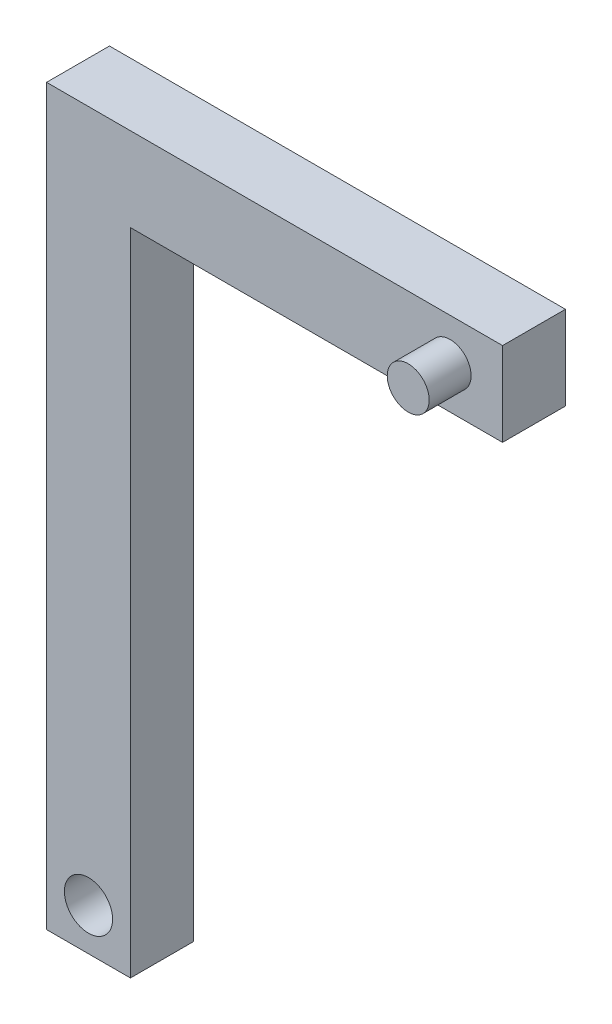
ISO-10303-21;
HEADER;
FILE_DESCRIPTION(('STEP AP214'),'2;1');
FILE_NAME('part.step','',(''),(''),'','','');
FILE_SCHEMA(('AUTOMOTIVE_DESIGN { 1 0 10303 214 1 1 1 1 }'));
ENDSEC;
DATA;
#1=APPLICATION_CONTEXT('core data for automotive mechanical design processes');
#2=APPLICATION_PROTOCOL_DEFINITION('international standard','automotive_design',2000,#1);
#3=PRODUCT_CONTEXT('',#1,'mechanical');
#4=PRODUCT('Part','Part','',(#3));
#5=PRODUCT_RELATED_PRODUCT_CATEGORY('part','',(#4));
#6=PRODUCT_DEFINITION_FORMATION('','',#4);
#7=PRODUCT_DEFINITION_CONTEXT('part definition',#1,'design');
#8=PRODUCT_DEFINITION('design','',#6,#7);
#9=PRODUCT_DEFINITION_SHAPE('','',#8);
#10=(LENGTH_UNIT() NAMED_UNIT(*) SI_UNIT(.MILLI.,.METRE.));
#11=(NAMED_UNIT(*) PLANE_ANGLE_UNIT() SI_UNIT($,.RADIAN.));
#12=(NAMED_UNIT(*) SI_UNIT($,.STERADIAN.) SOLID_ANGLE_UNIT());
#13=UNCERTAINTY_MEASURE_WITH_UNIT(LENGTH_MEASURE(1.E-05),#10,'distance_accuracy_value','');
#14=(GEOMETRIC_REPRESENTATION_CONTEXT(3) GLOBAL_UNCERTAINTY_ASSIGNED_CONTEXT((#13)) GLOBAL_UNIT_ASSIGNED_CONTEXT((#10,
#11,#12)) REPRESENTATION_CONTEXT('',''));
#15=CARTESIAN_POINT('',(0.,0.,0.));
#16=DIRECTION('',(0.,0.,1.));
#17=DIRECTION('',(1.,0.,0.));
#18=AXIS2_PLACEMENT_3D('',#15,#16,#17);
#19=CARTESIAN_POINT('',(0.,-4.,3.));
#20=DIRECTION('',(0.,1.,0.));
#21=DIRECTION('',(0.,0.,1.));
#22=AXIS2_PLACEMENT_3D('',#19,#20,#21);
#23=PLANE('',#22);
#24=DIRECTION('',(1.,0.,0.));
#25=VECTOR('',#24,1.);
#26=CARTESIAN_POINT('',(0.,-4.,3.));
#27=LINE('',#26,#25);
#28=CARTESIAN_POINT('',(4.75,-4.,3.));
#29=VERTEX_POINT('',#28);
#30=CARTESIAN_POINT('',(22.5,-4.,3.));
#31=VERTEX_POINT('',#30);
#32=EDGE_CURVE('E85',#29,#31,#27,.T.);
#33=ORIENTED_EDGE('',*,*,#32,.F.);
#34=DIRECTION('',(0.,0.,-1.));
#35=VECTOR('',#34,1.);
#36=CARTESIAN_POINT('',(4.75,-4.,3.));
#37=LINE('',#36,#35);
#38=CARTESIAN_POINT('',(4.75,-4.,0.));
#39=VERTEX_POINT('',#38);
#40=EDGE_CURVE('E97',#29,#39,#37,.T.);
#41=ORIENTED_EDGE('',*,*,#40,.T.);
#42=DIRECTION('',(1.,0.,0.));
#43=VECTOR('',#42,1.);
#44=CARTESIAN_POINT('',(0.,-4.,0.));
#45=LINE('',#44,#43);
#46=CARTESIAN_POINT('',(22.5,-4.,0.));
#47=VERTEX_POINT('',#46);
#48=EDGE_CURVE('E95',#39,#47,#45,.T.);
#49=ORIENTED_EDGE('',*,*,#48,.T.);
#50=DIRECTION('',(0.,0.,-1.));
#51=VECTOR('',#50,1.);
#52=CARTESIAN_POINT('',(22.5,-4.,3.));
#53=LINE('',#52,#51);
#54=EDGE_CURVE('E39',#31,#47,#53,.T.);
#55=ORIENTED_EDGE('',*,*,#54,.F.);
#56=EDGE_LOOP('',(#33,#41,#49,#55));
#57=FACE_BOUND('',#56,.T.);
#58=ADVANCED_FACE('F36',(#57),#23,.F.);
#59=CARTESIAN_POINT('',(22.5,0.,3.));
#60=DIRECTION('',(1.,0.,0.));
#61=DIRECTION('',(0.,0.,-1.));
#62=AXIS2_PLACEMENT_3D('',#59,#60,#61);
#63=PLANE('',#62);
#64=DIRECTION('',(0.,-1.,0.));
#65=VECTOR('',#64,1.);
#66=CARTESIAN_POINT('',(22.5,0.,0.));
#67=LINE('',#66,#65);
#68=CARTESIAN_POINT('',(22.5,0.,0.));
#69=VERTEX_POINT('',#68);
#70=EDGE_CURVE('E79',#69,#47,#67,.T.);
#71=ORIENTED_EDGE('',*,*,#70,.F.);
#72=DIRECTION('',(0.,0.,-1.));
#73=VECTOR('',#72,1.);
#74=CARTESIAN_POINT('',(22.5,0.,3.));
#75=LINE('',#74,#73);
#76=CARTESIAN_POINT('',(22.5,0.,3.));
#77=VERTEX_POINT('',#76);
#78=EDGE_CURVE('E87',#77,#69,#75,.T.);
#79=ORIENTED_EDGE('',*,*,#78,.F.);
#80=DIRECTION('',(0.,-1.,0.));
#81=VECTOR('',#80,1.);
#82=CARTESIAN_POINT('',(22.5,0.,3.));
#83=LINE('',#82,#81);
#84=EDGE_CURVE('E101',#77,#31,#83,.T.);
#85=ORIENTED_EDGE('',*,*,#84,.T.);
#86=ORIENTED_EDGE('',*,*,#54,.T.);
#87=EDGE_LOOP('',(#71,#79,#85,#86));
#88=FACE_BOUND('',#87,.T.);
#89=ADVANCED_FACE('F93',(#88),#63,.T.);
#90=CARTESIAN_POINT('',(0.,0.,3.));
#91=DIRECTION('',(0.,1.,0.));
#92=DIRECTION('',(0.,0.,1.));
#93=AXIS2_PLACEMENT_3D('',#90,#91,#92);
#94=PLANE('',#93);
#95=DIRECTION('',(0.,0.,-1.));
#96=VECTOR('',#95,1.);
#97=CARTESIAN_POINT('',(0.749999999999998,0.,3.));
#98=LINE('',#97,#96);
#99=CARTESIAN_POINT('',(0.749999999999998,0.,3.));
#100=VERTEX_POINT('',#99);
#101=CARTESIAN_POINT('',(0.749999999999998,0.,0.));
#102=VERTEX_POINT('',#101);
#103=EDGE_CURVE('E116',#100,#102,#98,.T.);
#104=ORIENTED_EDGE('',*,*,#103,.F.);
#105=DIRECTION('',(1.,0.,0.));
#106=VECTOR('',#105,1.);
#107=CARTESIAN_POINT('',(0.,0.,3.));
#108=LINE('',#107,#106);
#109=EDGE_CURVE('E60',#100,#77,#108,.T.);
#110=ORIENTED_EDGE('',*,*,#109,.T.);
#111=ORIENTED_EDGE('',*,*,#78,.T.);
#112=DIRECTION('',(1.,0.,0.));
#113=VECTOR('',#112,1.);
#114=CARTESIAN_POINT('',(0.,0.,0.));
#115=LINE('',#114,#113);
#116=EDGE_CURVE('E75',#102,#69,#115,.T.);
#117=ORIENTED_EDGE('',*,*,#116,.F.);
#118=EDGE_LOOP('',(#104,#110,#111,#117));
#119=FACE_BOUND('',#118,.T.);
#120=ADVANCED_FACE('F88',(#119),#94,.T.);
#121=CARTESIAN_POINT('',(0.,0.,3.));
#122=DIRECTION('',(0.,0.,1.));
#123=DIRECTION('',(1.,0.,0.));
#124=AXIS2_PLACEMENT_3D('',#121,#122,#123);
#125=PLANE('',#124);
#126=CARTESIAN_POINT('',(2.75,-33.,3.));
#127=DIRECTION('',(0.,0.,1.));
#128=DIRECTION('',(1.,0.,0.));
#129=AXIS2_PLACEMENT_3D('',#126,#127,#128);
#130=CIRCLE('',#129,1.15);
#131=CARTESIAN_POINT('',(3.89999999999999,-33.,3.));
#132=VERTEX_POINT('',#131);
#133=EDGE_CURVE('E128',#132,#132,#130,.T.);
#134=ORIENTED_EDGE('',*,*,#133,.F.);
#135=EDGE_LOOP('',(#134));
#136=FACE_BOUND('',#135,.T.);
#137=CARTESIAN_POINT('',(20.,-2.,3.));
#138=DIRECTION('',(0.,0.,1.));
#139=DIRECTION('',(1.,0.,0.));
#140=AXIS2_PLACEMENT_3D('',#137,#138,#139);
#141=CIRCLE('',#140,1.);
#142=CARTESIAN_POINT('',(21.,-2.,3.));
#143=VERTEX_POINT('',#142);
#144=EDGE_CURVE('E11',#143,#143,#141,.T.);
#145=ORIENTED_EDGE('',*,*,#144,.F.);
#146=EDGE_LOOP('',(#145));
#147=FACE_BOUND('',#146,.T.);
#148=ORIENTED_EDGE('',*,*,#109,.F.);
#149=DIRECTION('',(0.,1.,0.));
#150=VECTOR('',#149,1.);
#151=CARTESIAN_POINT('',(0.749999999999998,-4.,3.));
#152=LINE('',#151,#150);
#153=CARTESIAN_POINT('',(0.749999999999995,-35.,3.));
#154=VERTEX_POINT('',#153);
#155=EDGE_CURVE('E107',#154,#100,#152,.T.);
#156=ORIENTED_EDGE('',*,*,#155,.F.);
#157=DIRECTION('',(-1.,0.,0.));
#158=VECTOR('',#157,1.);
#159=CARTESIAN_POINT('',(4.74999999999999,-35.,3.));
#160=LINE('',#159,#158);
#161=CARTESIAN_POINT('',(4.74999999999999,-35.,3.));
#162=VERTEX_POINT('',#161);
#163=EDGE_CURVE('E119',#162,#154,#160,.T.);
#164=ORIENTED_EDGE('',*,*,#163,.F.);
#165=DIRECTION('',(0.,-1.,0.));
#166=VECTOR('',#165,1.);
#167=CARTESIAN_POINT('',(4.75,-4.,3.));
#168=LINE('',#167,#166);
#169=EDGE_CURVE('E112',#29,#162,#168,.T.);
#170=ORIENTED_EDGE('',*,*,#169,.F.);
#171=ORIENTED_EDGE('',*,*,#32,.T.);
#172=ORIENTED_EDGE('',*,*,#84,.F.);
#173=EDGE_LOOP('',(#148,#156,#164,#170,#171,#172));
#174=FACE_BOUND('',#173,.T.);
#175=ADVANCED_FACE('F139',(#136,#147,#174),#125,.T.);
#176=CARTESIAN_POINT('',(0.,0.,0.));
#177=DIRECTION('',(0.,0.,1.));
#178=DIRECTION('',(1.,0.,0.));
#179=AXIS2_PLACEMENT_3D('',#176,#177,#178);
#180=PLANE('',#179);
#181=CARTESIAN_POINT('',(2.75,-33.,0.));
#182=DIRECTION('',(0.,0.,-1.));
#183=DIRECTION('',(-1.,0.,0.));
#184=AXIS2_PLACEMENT_3D('',#181,#182,#183);
#185=CIRCLE('',#184,1.15);
#186=CARTESIAN_POINT('',(1.6,-33.,0.));
#187=VERTEX_POINT('',#186);
#188=EDGE_CURVE('E131',#187,#187,#185,.T.);
#189=ORIENTED_EDGE('',*,*,#188,.F.);
#190=EDGE_LOOP('',(#189));
#191=FACE_BOUND('',#190,.T.);
#192=DIRECTION('',(0.,1.,0.));
#193=VECTOR('',#192,1.);
#194=CARTESIAN_POINT('',(0.749999999999998,-4.,0.));
#195=LINE('',#194,#193);
#196=CARTESIAN_POINT('',(0.749999999999995,-35.,0.));
#197=VERTEX_POINT('',#196);
#198=EDGE_CURVE('E83',#197,#102,#195,.T.);
#199=ORIENTED_EDGE('',*,*,#198,.T.);
#200=ORIENTED_EDGE('',*,*,#116,.T.);
#201=ORIENTED_EDGE('',*,*,#70,.T.);
#202=ORIENTED_EDGE('',*,*,#48,.F.);
#203=DIRECTION('',(0.,-1.,0.));
#204=VECTOR('',#203,1.);
#205=CARTESIAN_POINT('',(4.75,-4.,0.));
#206=LINE('',#205,#204);
#207=CARTESIAN_POINT('',(4.74999999999999,-35.,0.));
#208=VERTEX_POINT('',#207);
#209=EDGE_CURVE('E51',#39,#208,#206,.T.);
#210=ORIENTED_EDGE('',*,*,#209,.T.);
#211=DIRECTION('',(-1.,0.,0.));
#212=VECTOR('',#211,1.);
#213=CARTESIAN_POINT('',(4.74999999999999,-35.,0.));
#214=LINE('',#213,#212);
#215=EDGE_CURVE('E113',#208,#197,#214,.T.);
#216=ORIENTED_EDGE('',*,*,#215,.T.);
#217=EDGE_LOOP('',(#199,#200,#201,#202,#210,#216));
#218=FACE_BOUND('',#217,.T.);
#219=ADVANCED_FACE('F76',(#191,#218),#180,.F.);
#220=CARTESIAN_POINT('',(4.75,-4.,3.));
#221=DIRECTION('',(1.,0.,0.));
#222=DIRECTION('',(0.,1.,0.));
#223=AXIS2_PLACEMENT_3D('',#220,#221,#222);
#224=PLANE('',#223);
#225=ORIENTED_EDGE('',*,*,#209,.F.);
#226=ORIENTED_EDGE('',*,*,#40,.F.);
#227=ORIENTED_EDGE('',*,*,#169,.T.);
#228=DIRECTION('',(0.,0.,-1.));
#229=VECTOR('',#228,1.);
#230=CARTESIAN_POINT('',(4.74999999999999,-35.,3.));
#231=LINE('',#230,#229);
#232=EDGE_CURVE('E104',#162,#208,#231,.T.);
#233=ORIENTED_EDGE('',*,*,#232,.T.);
#234=EDGE_LOOP('',(#225,#226,#227,#233));
#235=FACE_BOUND('',#234,.T.);
#236=ADVANCED_FACE('F138',(#235),#224,.T.);
#237=CARTESIAN_POINT('',(0.749999999999998,-4.,3.));
#238=DIRECTION('',(-1.,0.,0.));
#239=DIRECTION('',(0.,-1.,0.));
#240=AXIS2_PLACEMENT_3D('',#237,#238,#239);
#241=PLANE('',#240);
#242=ORIENTED_EDGE('',*,*,#198,.F.);
#243=DIRECTION('',(0.,0.,-1.));
#244=VECTOR('',#243,1.);
#245=CARTESIAN_POINT('',(0.749999999999995,-35.,3.));
#246=LINE('',#245,#244);
#247=EDGE_CURVE('E106',#154,#197,#246,.T.);
#248=ORIENTED_EDGE('',*,*,#247,.F.);
#249=ORIENTED_EDGE('',*,*,#155,.T.);
#250=ORIENTED_EDGE('',*,*,#103,.T.);
#251=EDGE_LOOP('',(#242,#248,#249,#250));
#252=FACE_BOUND('',#251,.T.);
#253=ADVANCED_FACE('F145',(#252),#241,.T.);
#254=CARTESIAN_POINT('',(4.74999999999999,-35.,3.));
#255=DIRECTION('',(0.,-1.,0.));
#256=DIRECTION('',(0.,0.,-1.));
#257=AXIS2_PLACEMENT_3D('',#254,#255,#256);
#258=PLANE('',#257);
#259=ORIENTED_EDGE('',*,*,#215,.F.);
#260=ORIENTED_EDGE('',*,*,#232,.F.);
#261=ORIENTED_EDGE('',*,*,#163,.T.);
#262=ORIENTED_EDGE('',*,*,#247,.T.);
#263=EDGE_LOOP('',(#259,#260,#261,#262));
#264=FACE_BOUND('',#263,.T.);
#265=ADVANCED_FACE('F176',(#264),#258,.T.);
#266=CARTESIAN_POINT('',(20.,-2.,5.));
#267=DIRECTION('',(0.,0.,-1.));
#268=DIRECTION('',(-1.,0.,0.));
#269=AXIS2_PLACEMENT_3D('',#266,#267,#268);
#270=CYLINDRICAL_SURFACE('',#269,1.);
#271=ORIENTED_EDGE('',*,*,#144,.T.);
#272=EDGE_LOOP('',(#271));
#273=FACE_BOUND('',#272,.T.);
#274=CARTESIAN_POINT('',(20.,-2.,5.));
#275=DIRECTION('',(0.,0.,-1.));
#276=DIRECTION('',(-1.,0.,0.));
#277=AXIS2_PLACEMENT_3D('',#274,#275,#276);
#278=CIRCLE('',#277,1.);
#279=CARTESIAN_POINT('',(19.,-2.,5.));
#280=VERTEX_POINT('',#279);
#281=EDGE_CURVE('E124',#280,#280,#278,.T.);
#282=ORIENTED_EDGE('',*,*,#281,.T.);
#283=EDGE_LOOP('',(#282));
#284=FACE_BOUND('',#283,.T.);
#285=ADVANCED_FACE('F178',(#273,#284),#270,.T.);
#286=CARTESIAN_POINT('',(20.,-2.,5.));
#287=DIRECTION('',(0.,0.,-1.));
#288=DIRECTION('',(-1.,0.,0.));
#289=AXIS2_PLACEMENT_3D('',#286,#287,#288);
#290=PLANE('',#289);
#291=ORIENTED_EDGE('',*,*,#281,.F.);
#292=EDGE_LOOP('',(#291));
#293=FACE_BOUND('',#292,.T.);
#294=ADVANCED_FACE('F184',(#293),#290,.F.);
#295=CARTESIAN_POINT('',(2.75,-33.,5.));
#296=DIRECTION('',(0.,0.,-1.));
#297=DIRECTION('',(-1.,0.,0.));
#298=AXIS2_PLACEMENT_3D('',#295,#296,#297);
#299=CYLINDRICAL_SURFACE('',#298,1.15);
#300=ORIENTED_EDGE('',*,*,#133,.T.);
#301=EDGE_LOOP('',(#300));
#302=FACE_BOUND('',#301,.T.);
#303=ORIENTED_EDGE('',*,*,#188,.T.);
#304=EDGE_LOOP('',(#303));
#305=FACE_BOUND('',#304,.T.);
#306=ADVANCED_FACE('F135',(#302,#305),#299,.F.);
#307=CLOSED_SHELL('',(#58,#89,#120,#175,#219,#236,#253,#265,#285,#294,#306));
#308=MANIFOLD_SOLID_BREP('B2',#307);
#309=ADVANCED_BREP_SHAPE_REPRESENTATION('',(#18,#308),#14);
#310=SHAPE_DEFINITION_REPRESENTATION(#9,#309);
ENDSEC;
END-ISO-10303-21;
